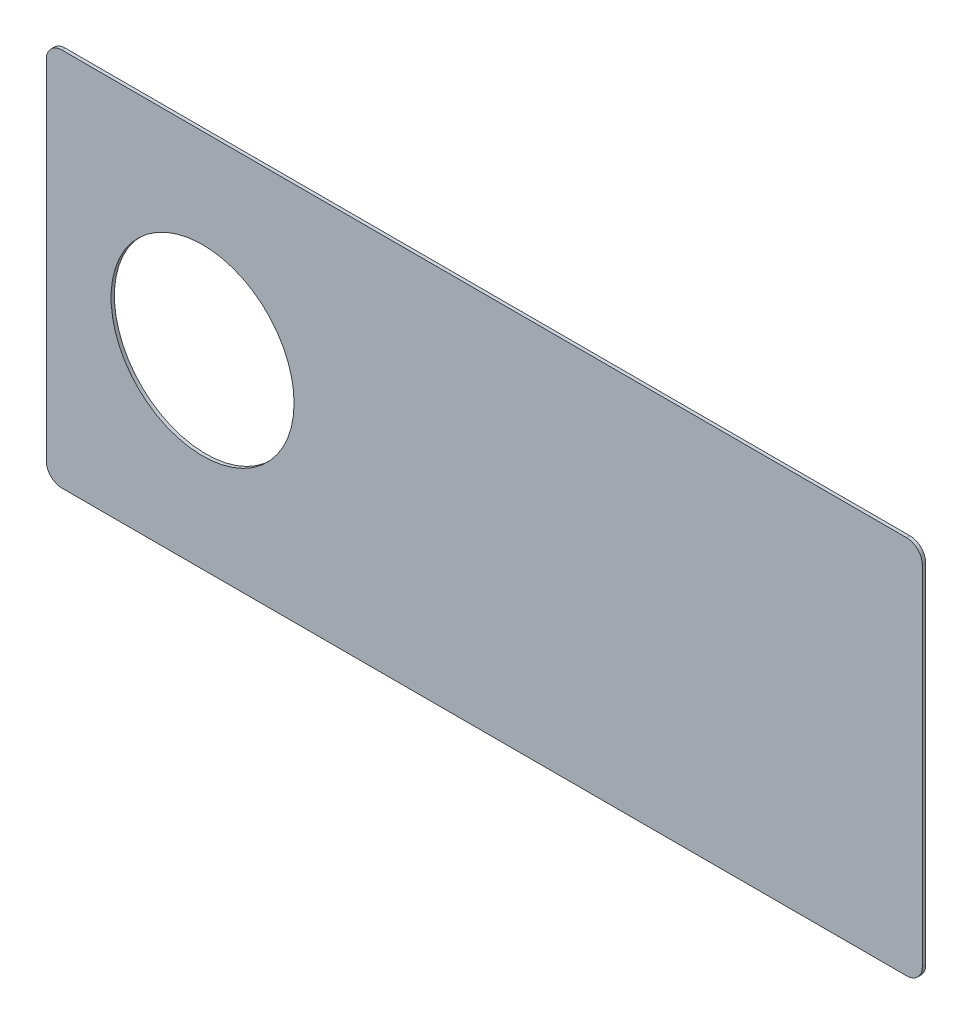
ISO-10303-21;
HEADER;
FILE_DESCRIPTION(('STEP AP214'),'2;1');
FILE_NAME('part.step','',(''),(''),'','','');
FILE_SCHEMA(('AUTOMOTIVE_DESIGN { 1 0 10303 214 1 1 1 1 }'));
ENDSEC;
DATA;
#1=APPLICATION_CONTEXT('core data for automotive mechanical design processes');
#2=APPLICATION_PROTOCOL_DEFINITION('international standard','automotive_design',2000,#1);
#3=PRODUCT_CONTEXT('',#1,'mechanical');
#4=PRODUCT('Part','Part','',(#3));
#5=PRODUCT_RELATED_PRODUCT_CATEGORY('part','',(#4));
#6=PRODUCT_DEFINITION_FORMATION('','',#4);
#7=PRODUCT_DEFINITION_CONTEXT('part definition',#1,'design');
#8=PRODUCT_DEFINITION('design','',#6,#7);
#9=PRODUCT_DEFINITION_SHAPE('','',#8);
#10=(LENGTH_UNIT() NAMED_UNIT(*) SI_UNIT(.MILLI.,.METRE.));
#11=(NAMED_UNIT(*) PLANE_ANGLE_UNIT() SI_UNIT($,.RADIAN.));
#12=(NAMED_UNIT(*) SI_UNIT($,.STERADIAN.) SOLID_ANGLE_UNIT());
#13=UNCERTAINTY_MEASURE_WITH_UNIT(LENGTH_MEASURE(1.E-05),#10,'distance_accuracy_value','');
#14=(GEOMETRIC_REPRESENTATION_CONTEXT(3) GLOBAL_UNCERTAINTY_ASSIGNED_CONTEXT((#13)) GLOBAL_UNIT_ASSIGNED_CONTEXT((#10,
#11,#12)) REPRESENTATION_CONTEXT('',''));
#15=CARTESIAN_POINT('',(0.,0.,0.));
#16=DIRECTION('',(0.,0.,1.));
#17=DIRECTION('',(1.,0.,0.));
#18=AXIS2_PLACEMENT_3D('',#15,#16,#17);
#19=CARTESIAN_POINT('',(871.,156.,303.));
#20=DIRECTION('',(0.,0.,1.));
#21=DIRECTION('',(1.,0.,0.));
#22=AXIS2_PLACEMENT_3D('',#19,#20,#21);
#23=PLANE('',#22);
#24=CARTESIAN_POINT('',(871.,156.,303.));
#25=DIRECTION('',(0.,0.,1.));
#26=DIRECTION('',(1.,0.,0.));
#27=AXIS2_PLACEMENT_3D('',#24,#25,#26);
#28=CIRCLE('',#27,14.0000000000001);
#29=CARTESIAN_POINT('',(885.,156.,303.));
#30=VERTEX_POINT('',#29);
#31=CARTESIAN_POINT('',(871.,170.,303.));
#32=VERTEX_POINT('',#31);
#33=EDGE_CURVE('E152',#30,#32,#28,.T.);
#34=ORIENTED_EDGE('',*,*,#33,.T.);
#35=DIRECTION('',(-1.,0.,0.));
#36=VECTOR('',#35,1.);
#37=CARTESIAN_POINT('',(871.,170.,303.));
#38=LINE('',#37,#36);
#39=CARTESIAN_POINT('',(114.,170.,303.));
#40=VERTEX_POINT('',#39);
#41=EDGE_CURVE('E98',#32,#40,#38,.T.);
#42=ORIENTED_EDGE('',*,*,#41,.T.);
#43=CARTESIAN_POINT('',(114.,156.,303.));
#44=DIRECTION('',(0.,0.,1.));
#45=DIRECTION('',(1.,0.,0.));
#46=AXIS2_PLACEMENT_3D('',#43,#44,#45);
#47=CIRCLE('',#46,14.);
#48=CARTESIAN_POINT('',(100.,156.,303.));
#49=VERTEX_POINT('',#48);
#50=EDGE_CURVE('E168',#40,#49,#47,.T.);
#51=ORIENTED_EDGE('',*,*,#50,.T.);
#52=DIRECTION('',(0.,-1.,0.));
#53=VECTOR('',#52,1.);
#54=CARTESIAN_POINT('',(100.,156.,303.));
#55=LINE('',#54,#53);
#56=CARTESIAN_POINT('',(100.,-156.,303.));
#57=VERTEX_POINT('',#56);
#58=EDGE_CURVE('E177',#49,#57,#55,.T.);
#59=ORIENTED_EDGE('',*,*,#58,.T.);
#60=CARTESIAN_POINT('',(114.,-156.,303.));
#61=DIRECTION('',(0.,0.,1.));
#62=DIRECTION('',(1.,0.,0.));
#63=AXIS2_PLACEMENT_3D('',#60,#61,#62);
#64=CIRCLE('',#63,14.);
#65=CARTESIAN_POINT('',(114.,-170.,303.));
#66=VERTEX_POINT('',#65);
#67=EDGE_CURVE('E120',#57,#66,#64,.T.);
#68=ORIENTED_EDGE('',*,*,#67,.T.);
#69=DIRECTION('',(1.,0.,0.));
#70=VECTOR('',#69,1.);
#71=CARTESIAN_POINT('',(114.,-170.,303.));
#72=LINE('',#71,#70);
#73=CARTESIAN_POINT('',(871.,-170.,303.));
#74=VERTEX_POINT('',#73);
#75=EDGE_CURVE('E115',#66,#74,#72,.T.);
#76=ORIENTED_EDGE('',*,*,#75,.T.);
#77=CARTESIAN_POINT('',(871.,-156.,303.));
#78=DIRECTION('',(0.,0.,1.));
#79=DIRECTION('',(1.,0.,0.));
#80=AXIS2_PLACEMENT_3D('',#77,#78,#79);
#81=CIRCLE('',#80,14.);
#82=CARTESIAN_POINT('',(885.,-156.,303.));
#83=VERTEX_POINT('',#82);
#84=EDGE_CURVE('E117',#74,#83,#81,.T.);
#85=ORIENTED_EDGE('',*,*,#84,.T.);
#86=DIRECTION('',(0.,1.,0.));
#87=VECTOR('',#86,1.);
#88=CARTESIAN_POINT('',(885.,-156.,303.));
#89=LINE('',#88,#87);
#90=EDGE_CURVE('E57',#83,#30,#89,.T.);
#91=ORIENTED_EDGE('',*,*,#90,.T.);
#92=EDGE_LOOP('',(#34,#42,#51,#59,#68,#76,#85,#91));
#93=FACE_BOUND('',#92,.T.);
#94=CARTESIAN_POINT('',(240.,0.,303.));
#95=DIRECTION('',(0.,0.,1.));
#96=DIRECTION('',(1.,0.,0.));
#97=AXIS2_PLACEMENT_3D('',#94,#95,#96);
#98=CIRCLE('',#97,82.);
#99=CARTESIAN_POINT('',(322.,0.,303.));
#100=VERTEX_POINT('',#99);
#101=EDGE_CURVE('E139',#100,#100,#98,.T.);
#102=ORIENTED_EDGE('',*,*,#101,.F.);
#103=EDGE_LOOP('',(#102));
#104=FACE_BOUND('',#103,.T.);
#105=ADVANCED_FACE('F39',(#93,#104),#23,.T.);
#106=CARTESIAN_POINT('',(871.,156.,300.));
#107=DIRECTION('',(0.,0.,1.));
#108=DIRECTION('',(1.,0.,0.));
#109=AXIS2_PLACEMENT_3D('',#106,#107,#108);
#110=PLANE('',#109);
#111=CARTESIAN_POINT('',(871.,156.,300.));
#112=DIRECTION('',(0.,0.,1.));
#113=DIRECTION('',(1.,0.,0.));
#114=AXIS2_PLACEMENT_3D('',#111,#112,#113);
#115=CIRCLE('',#114,14.0000000000001);
#116=CARTESIAN_POINT('',(885.,156.,300.));
#117=VERTEX_POINT('',#116);
#118=CARTESIAN_POINT('',(871.,170.,300.));
#119=VERTEX_POINT('',#118);
#120=EDGE_CURVE('E136',#117,#119,#115,.T.);
#121=ORIENTED_EDGE('',*,*,#120,.F.);
#122=DIRECTION('',(0.,1.,0.));
#123=VECTOR('',#122,1.);
#124=CARTESIAN_POINT('',(885.,-156.,300.));
#125=LINE('',#124,#123);
#126=CARTESIAN_POINT('',(885.,-156.,300.));
#127=VERTEX_POINT('',#126);
#128=EDGE_CURVE('E91',#127,#117,#125,.T.);
#129=ORIENTED_EDGE('',*,*,#128,.F.);
#130=CARTESIAN_POINT('',(871.,-156.,300.));
#131=DIRECTION('',(0.,0.,1.));
#132=DIRECTION('',(1.,0.,0.));
#133=AXIS2_PLACEMENT_3D('',#130,#131,#132);
#134=CIRCLE('',#133,14.);
#135=CARTESIAN_POINT('',(871.,-170.,300.));
#136=VERTEX_POINT('',#135);
#137=EDGE_CURVE('E82',#136,#127,#134,.T.);
#138=ORIENTED_EDGE('',*,*,#137,.F.);
#139=DIRECTION('',(1.,0.,0.));
#140=VECTOR('',#139,1.);
#141=CARTESIAN_POINT('',(114.,-170.,300.));
#142=LINE('',#141,#140);
#143=CARTESIAN_POINT('',(114.,-170.,300.));
#144=VERTEX_POINT('',#143);
#145=EDGE_CURVE('E128',#144,#136,#142,.T.);
#146=ORIENTED_EDGE('',*,*,#145,.F.);
#147=CARTESIAN_POINT('',(114.,-156.,300.));
#148=DIRECTION('',(0.,0.,1.));
#149=DIRECTION('',(1.,0.,0.));
#150=AXIS2_PLACEMENT_3D('',#147,#148,#149);
#151=CIRCLE('',#150,14.);
#152=CARTESIAN_POINT('',(100.,-156.,300.));
#153=VERTEX_POINT('',#152);
#154=EDGE_CURVE('E147',#153,#144,#151,.T.);
#155=ORIENTED_EDGE('',*,*,#154,.F.);
#156=DIRECTION('',(0.,-1.,0.));
#157=VECTOR('',#156,1.);
#158=CARTESIAN_POINT('',(100.,156.,300.));
#159=LINE('',#158,#157);
#160=CARTESIAN_POINT('',(100.,156.,300.));
#161=VERTEX_POINT('',#160);
#162=EDGE_CURVE('E143',#161,#153,#159,.T.);
#163=ORIENTED_EDGE('',*,*,#162,.F.);
#164=CARTESIAN_POINT('',(114.,156.,300.));
#165=DIRECTION('',(0.,0.,1.));
#166=DIRECTION('',(1.,0.,0.));
#167=AXIS2_PLACEMENT_3D('',#164,#165,#166);
#168=CIRCLE('',#167,14.);
#169=CARTESIAN_POINT('',(114.,170.,300.));
#170=VERTEX_POINT('',#169);
#171=EDGE_CURVE('E145',#170,#161,#168,.T.);
#172=ORIENTED_EDGE('',*,*,#171,.F.);
#173=DIRECTION('',(-1.,0.,0.));
#174=VECTOR('',#173,1.);
#175=CARTESIAN_POINT('',(871.,170.,300.));
#176=LINE('',#175,#174);
#177=EDGE_CURVE('E137',#119,#170,#176,.T.);
#178=ORIENTED_EDGE('',*,*,#177,.F.);
#179=EDGE_LOOP('',(#121,#129,#138,#146,#155,#163,#172,#178));
#180=FACE_BOUND('',#179,.T.);
#181=CARTESIAN_POINT('',(240.,0.,300.));
#182=DIRECTION('',(0.,0.,1.));
#183=DIRECTION('',(1.,0.,0.));
#184=AXIS2_PLACEMENT_3D('',#181,#182,#183);
#185=CIRCLE('',#184,82.);
#186=CARTESIAN_POINT('',(322.,0.,300.));
#187=VERTEX_POINT('',#186);
#188=EDGE_CURVE('E184',#187,#187,#185,.T.);
#189=ORIENTED_EDGE('',*,*,#188,.T.);
#190=EDGE_LOOP('',(#189));
#191=FACE_BOUND('',#190,.T.);
#192=ADVANCED_FACE('F169',(#180,#191),#110,.F.);
#193=CARTESIAN_POINT('',(871.,156.,303.));
#194=DIRECTION('',(0.,0.,-1.));
#195=DIRECTION('',(-1.,0.,0.));
#196=AXIS2_PLACEMENT_3D('',#193,#194,#195);
#197=CYLINDRICAL_SURFACE('',#196,14.0000000000001);
#198=ORIENTED_EDGE('',*,*,#120,.T.);
#199=DIRECTION('',(0.,0.,-1.));
#200=VECTOR('',#199,1.);
#201=CARTESIAN_POINT('',(871.,170.,303.));
#202=LINE('',#201,#200);
#203=EDGE_CURVE('E11',#32,#119,#202,.T.);
#204=ORIENTED_EDGE('',*,*,#203,.F.);
#205=ORIENTED_EDGE('',*,*,#33,.F.);
#206=DIRECTION('',(0.,0.,-1.));
#207=VECTOR('',#206,1.);
#208=CARTESIAN_POINT('',(885.,156.,303.));
#209=LINE('',#208,#207);
#210=EDGE_CURVE('E135',#30,#117,#209,.T.);
#211=ORIENTED_EDGE('',*,*,#210,.T.);
#212=EDGE_LOOP('',(#198,#204,#205,#211));
#213=FACE_BOUND('',#212,.T.);
#214=ADVANCED_FACE('F41',(#213),#197,.T.);
#215=CARTESIAN_POINT('',(871.,170.,303.));
#216=DIRECTION('',(0.,-1.,0.));
#217=DIRECTION('',(0.,0.,-1.));
#218=AXIS2_PLACEMENT_3D('',#215,#216,#217);
#219=PLANE('',#218);
#220=ORIENTED_EDGE('',*,*,#177,.T.);
#221=DIRECTION('',(0.,0.,-1.));
#222=VECTOR('',#221,1.);
#223=CARTESIAN_POINT('',(114.,170.,303.));
#224=LINE('',#223,#222);
#225=EDGE_CURVE('E48',#40,#170,#224,.T.);
#226=ORIENTED_EDGE('',*,*,#225,.F.);
#227=ORIENTED_EDGE('',*,*,#41,.F.);
#228=ORIENTED_EDGE('',*,*,#203,.T.);
#229=EDGE_LOOP('',(#220,#226,#227,#228));
#230=FACE_BOUND('',#229,.T.);
#231=ADVANCED_FACE('F211',(#230),#219,.F.);
#232=CARTESIAN_POINT('',(114.,156.,303.));
#233=DIRECTION('',(0.,0.,-1.));
#234=DIRECTION('',(-1.,0.,0.));
#235=AXIS2_PLACEMENT_3D('',#232,#233,#234);
#236=CYLINDRICAL_SURFACE('',#235,14.);
#237=ORIENTED_EDGE('',*,*,#171,.T.);
#238=DIRECTION('',(0.,0.,-1.));
#239=VECTOR('',#238,1.);
#240=CARTESIAN_POINT('',(100.,156.,303.));
#241=LINE('',#240,#239);
#242=EDGE_CURVE('E156',#49,#161,#241,.T.);
#243=ORIENTED_EDGE('',*,*,#242,.F.);
#244=ORIENTED_EDGE('',*,*,#50,.F.);
#245=ORIENTED_EDGE('',*,*,#225,.T.);
#246=EDGE_LOOP('',(#237,#243,#244,#245));
#247=FACE_BOUND('',#246,.T.);
#248=ADVANCED_FACE('F161',(#247),#236,.T.);
#249=CARTESIAN_POINT('',(100.,156.,303.));
#250=DIRECTION('',(1.,0.,0.));
#251=DIRECTION('',(0.,0.,-1.));
#252=AXIS2_PLACEMENT_3D('',#249,#250,#251);
#253=PLANE('',#252);
#254=ORIENTED_EDGE('',*,*,#162,.T.);
#255=DIRECTION('',(0.,0.,-1.));
#256=VECTOR('',#255,1.);
#257=CARTESIAN_POINT('',(100.,-156.,303.));
#258=LINE('',#257,#256);
#259=EDGE_CURVE('E153',#57,#153,#258,.T.);
#260=ORIENTED_EDGE('',*,*,#259,.F.);
#261=ORIENTED_EDGE('',*,*,#58,.F.);
#262=ORIENTED_EDGE('',*,*,#242,.T.);
#263=EDGE_LOOP('',(#254,#260,#261,#262));
#264=FACE_BOUND('',#263,.T.);
#265=ADVANCED_FACE('F172',(#264),#253,.F.);
#266=CARTESIAN_POINT('',(114.,-156.,303.));
#267=DIRECTION('',(0.,0.,-1.));
#268=DIRECTION('',(-1.,0.,0.));
#269=AXIS2_PLACEMENT_3D('',#266,#267,#268);
#270=CYLINDRICAL_SURFACE('',#269,14.);
#271=ORIENTED_EDGE('',*,*,#154,.T.);
#272=DIRECTION('',(0.,0.,-1.));
#273=VECTOR('',#272,1.);
#274=CARTESIAN_POINT('',(114.,-170.,303.));
#275=LINE('',#274,#273);
#276=EDGE_CURVE('E130',#66,#144,#275,.T.);
#277=ORIENTED_EDGE('',*,*,#276,.F.);
#278=ORIENTED_EDGE('',*,*,#67,.F.);
#279=ORIENTED_EDGE('',*,*,#259,.T.);
#280=EDGE_LOOP('',(#271,#277,#278,#279));
#281=FACE_BOUND('',#280,.T.);
#282=ADVANCED_FACE('F178',(#281),#270,.T.);
#283=CARTESIAN_POINT('',(114.,-170.,303.));
#284=DIRECTION('',(0.,1.,0.));
#285=DIRECTION('',(0.,0.,1.));
#286=AXIS2_PLACEMENT_3D('',#283,#284,#285);
#287=PLANE('',#286);
#288=ORIENTED_EDGE('',*,*,#145,.T.);
#289=DIRECTION('',(0.,0.,-1.));
#290=VECTOR('',#289,1.);
#291=CARTESIAN_POINT('',(871.,-170.,303.));
#292=LINE('',#291,#290);
#293=EDGE_CURVE('E121',#74,#136,#292,.T.);
#294=ORIENTED_EDGE('',*,*,#293,.F.);
#295=ORIENTED_EDGE('',*,*,#75,.F.);
#296=ORIENTED_EDGE('',*,*,#276,.T.);
#297=EDGE_LOOP('',(#288,#294,#295,#296));
#298=FACE_BOUND('',#297,.T.);
#299=ADVANCED_FACE('F125',(#298),#287,.F.);
#300=CARTESIAN_POINT('',(871.,-156.,303.));
#301=DIRECTION('',(0.,0.,-1.));
#302=DIRECTION('',(-1.,0.,0.));
#303=AXIS2_PLACEMENT_3D('',#300,#301,#302);
#304=CYLINDRICAL_SURFACE('',#303,14.);
#305=ORIENTED_EDGE('',*,*,#137,.T.);
#306=DIRECTION('',(0.,0.,-1.));
#307=VECTOR('',#306,1.);
#308=CARTESIAN_POINT('',(885.,-156.,303.));
#309=LINE('',#308,#307);
#310=EDGE_CURVE('E126',#83,#127,#309,.T.);
#311=ORIENTED_EDGE('',*,*,#310,.F.);
#312=ORIENTED_EDGE('',*,*,#84,.F.);
#313=ORIENTED_EDGE('',*,*,#293,.T.);
#314=EDGE_LOOP('',(#305,#311,#312,#313));
#315=FACE_BOUND('',#314,.T.);
#316=ADVANCED_FACE('F127',(#315),#304,.T.);
#317=CARTESIAN_POINT('',(885.,-156.,303.));
#318=DIRECTION('',(-1.,0.,0.));
#319=DIRECTION('',(0.,0.,1.));
#320=AXIS2_PLACEMENT_3D('',#317,#318,#319);
#321=PLANE('',#320);
#322=ORIENTED_EDGE('',*,*,#128,.T.);
#323=ORIENTED_EDGE('',*,*,#210,.F.);
#324=ORIENTED_EDGE('',*,*,#90,.F.);
#325=ORIENTED_EDGE('',*,*,#310,.T.);
#326=EDGE_LOOP('',(#322,#323,#324,#325));
#327=FACE_BOUND('',#326,.T.);
#328=ADVANCED_FACE('F202',(#327),#321,.F.);
#329=CARTESIAN_POINT('',(240.,0.,303.));
#330=DIRECTION('',(0.,0.,-1.));
#331=DIRECTION('',(-1.,0.,0.));
#332=AXIS2_PLACEMENT_3D('',#329,#330,#331);
#333=CYLINDRICAL_SURFACE('',#332,82.);
#334=ORIENTED_EDGE('',*,*,#101,.T.);
#335=EDGE_LOOP('',(#334));
#336=FACE_BOUND('',#335,.T.);
#337=ORIENTED_EDGE('',*,*,#188,.F.);
#338=EDGE_LOOP('',(#337));
#339=FACE_BOUND('',#338,.T.);
#340=ADVANCED_FACE('F192',(#336,#339),#333,.F.);
#341=CLOSED_SHELL('',(#105,#192,#214,#231,#248,#265,#282,#299,#316,#328,#340));
#342=MANIFOLD_SOLID_BREP('B2',#341);
#343=ADVANCED_BREP_SHAPE_REPRESENTATION('',(#18,#342),#14);
#344=SHAPE_DEFINITION_REPRESENTATION(#9,#343);
ENDSEC;
END-ISO-10303-21;
